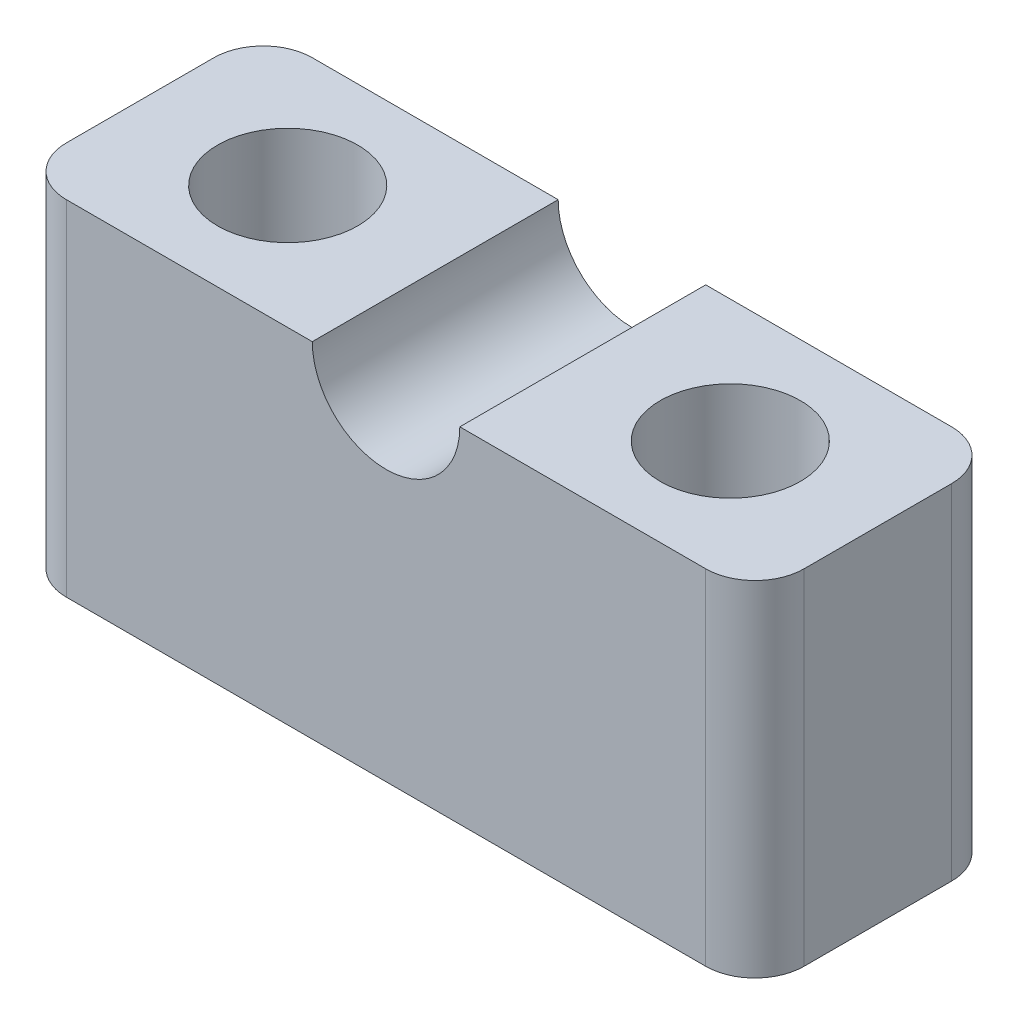
ISO-10303-21;
HEADER;
FILE_DESCRIPTION(('STEP AP214'),'2;1');
FILE_NAME('part.step','',(''),(''),'','','');
FILE_SCHEMA(('AUTOMOTIVE_DESIGN { 1 0 10303 214 1 1 1 1 }'));
ENDSEC;
DATA;
#1=APPLICATION_CONTEXT('core data for automotive mechanical design processes');
#2=APPLICATION_PROTOCOL_DEFINITION('international standard','automotive_design',2000,#1);
#3=PRODUCT_CONTEXT('',#1,'mechanical');
#4=PRODUCT('Part','Part','',(#3));
#5=PRODUCT_RELATED_PRODUCT_CATEGORY('part','',(#4));
#6=PRODUCT_DEFINITION_FORMATION('','',#4);
#7=PRODUCT_DEFINITION_CONTEXT('part definition',#1,'design');
#8=PRODUCT_DEFINITION('design','',#6,#7);
#9=PRODUCT_DEFINITION_SHAPE('','',#8);
#10=(LENGTH_UNIT() NAMED_UNIT(*) SI_UNIT(.MILLI.,.METRE.));
#11=(NAMED_UNIT(*) PLANE_ANGLE_UNIT() SI_UNIT($,.RADIAN.));
#12=(NAMED_UNIT(*) SI_UNIT($,.STERADIAN.) SOLID_ANGLE_UNIT());
#13=UNCERTAINTY_MEASURE_WITH_UNIT(LENGTH_MEASURE(1.E-05),#10,'distance_accuracy_value','');
#14=(GEOMETRIC_REPRESENTATION_CONTEXT(3) GLOBAL_UNCERTAINTY_ASSIGNED_CONTEXT((#13)) GLOBAL_UNIT_ASSIGNED_CONTEXT((#10,
#11,#12)) REPRESENTATION_CONTEXT('',''));
#15=CARTESIAN_POINT('',(0.,0.,0.));
#16=DIRECTION('',(0.,0.,1.));
#17=DIRECTION('',(1.,0.,0.));
#18=AXIS2_PLACEMENT_3D('',#15,#16,#17);
#19=CARTESIAN_POINT('',(0.,7.,0.));
#20=DIRECTION('',(0.,-1.,0.));
#21=DIRECTION('',(0.,0.,-1.));
#22=AXIS2_PLACEMENT_3D('',#19,#20,#21);
#23=PLANE('',#22);
#24=CARTESIAN_POINT('',(-1.05940594059406,7.,-0.346534653465347));
#25=DIRECTION('',(0.,1.,0.));
#26=DIRECTION('',(0.,0.,1.));
#27=AXIS2_PLACEMENT_3D('',#24,#25,#26);
#28=CIRCLE('',#27,1.425);
#29=CARTESIAN_POINT('',(-1.05940594059406,7.,1.07846534653465));
#30=VERTEX_POINT('',#29);
#31=EDGE_CURVE('E281',#30,#30,#28,.T.);
#32=ORIENTED_EDGE('',*,*,#31,.F.);
#33=EDGE_LOOP('',(#32));
#34=FACE_BOUND('',#33,.T.);
#35=DIRECTION('',(0.,0.,1.));
#36=VECTOR('',#35,1.);
#37=CARTESIAN_POINT('',(-4.05940594059406,7.,2.15346534653465));
#38=LINE('',#37,#36);
#39=CARTESIAN_POINT('',(-4.05940594059406,7.,-1.84653465346535));
#40=VERTEX_POINT('',#39);
#41=CARTESIAN_POINT('',(-4.05940594059406,7.,1.15346534653465));
#42=VERTEX_POINT('',#41);
#43=EDGE_CURVE('E169',#40,#42,#38,.T.);
#44=ORIENTED_EDGE('',*,*,#43,.T.);
#45=CARTESIAN_POINT('',(-3.05940594059406,7.,1.15346534653465));
#46=DIRECTION('',(0.,-1.,0.));
#47=DIRECTION('',(0.,0.,-1.));
#48=AXIS2_PLACEMENT_3D('',#45,#46,#47);
#49=CIRCLE('',#48,1.);
#50=CARTESIAN_POINT('',(-3.05940594059406,7.,2.15346534653465));
#51=VERTEX_POINT('',#50);
#52=EDGE_CURVE('E200',#42,#51,#49,.F.);
#53=ORIENTED_EDGE('',*,*,#52,.T.);
#54=DIRECTION('',(1.,0.,0.));
#55=VECTOR('',#54,1.);
#56=CARTESIAN_POINT('',(-4.05940594059406,7.,2.15346534653465));
#57=LINE('',#56,#55);
#58=CARTESIAN_POINT('',(1.94059405940594,7.,2.15346534653465));
#59=VERTEX_POINT('',#58);
#60=EDGE_CURVE('E139',#51,#59,#57,.T.);
#61=ORIENTED_EDGE('',*,*,#60,.T.);
#62=DIRECTION('',(0.,0.,-1.));
#63=VECTOR('',#62,1.);
#64=CARTESIAN_POINT('',(1.94059405940594,7.,2.15346534653465));
#65=LINE('',#64,#63);
#66=CARTESIAN_POINT('',(1.94059405940594,7.,-2.84653465346535));
#67=VERTEX_POINT('',#66);
#68=EDGE_CURVE('E123',#59,#67,#65,.T.);
#69=ORIENTED_EDGE('',*,*,#68,.T.);
#70=DIRECTION('',(-1.,0.,0.));
#71=VECTOR('',#70,1.);
#72=CARTESIAN_POINT('',(-4.05940594059406,7.,-2.84653465346535));
#73=LINE('',#72,#71);
#74=CARTESIAN_POINT('',(-3.05940594059406,7.,-2.84653465346535));
#75=VERTEX_POINT('',#74);
#76=EDGE_CURVE('E136',#67,#75,#73,.T.);
#77=ORIENTED_EDGE('',*,*,#76,.T.);
#78=CARTESIAN_POINT('',(-3.05940594059406,7.,-1.84653465346535));
#79=DIRECTION('',(0.,-1.,0.));
#80=DIRECTION('',(0.,0.,-1.));
#81=AXIS2_PLACEMENT_3D('',#78,#79,#80);
#82=CIRCLE('',#81,1.);
#83=EDGE_CURVE('E197',#75,#40,#82,.F.);
#84=ORIENTED_EDGE('',*,*,#83,.T.);
#85=EDGE_LOOP('',(#44,#53,#61,#69,#77,#84));
#86=FACE_BOUND('',#85,.T.);
#87=ADVANCED_FACE('F39',(#34,#86),#23,.F.);
#88=CARTESIAN_POINT('',(-4.05940594059406,7.,2.15346534653465));
#89=DIRECTION('',(1.,0.,0.));
#90=DIRECTION('',(0.,0.,-1.));
#91=AXIS2_PLACEMENT_3D('',#88,#89,#90);
#92=PLANE('',#91);
#93=DIRECTION('',(0.,0.,1.));
#94=VECTOR('',#93,1.);
#95=CARTESIAN_POINT('',(-4.05940594059406,0.,2.15346534653465));
#96=LINE('',#95,#94);
#97=CARTESIAN_POINT('',(-4.05940594059406,0.,-1.84653465346535));
#98=VERTEX_POINT('',#97);
#99=CARTESIAN_POINT('',(-4.05940594059406,0.,1.15346534653465));
#100=VERTEX_POINT('',#99);
#101=EDGE_CURVE('E155',#98,#100,#96,.T.);
#102=ORIENTED_EDGE('',*,*,#101,.T.);
#103=DIRECTION('',(0.,-1.,0.));
#104=VECTOR('',#103,1.);
#105=CARTESIAN_POINT('',(-4.05940594059406,7.,1.15346534653465));
#106=LINE('',#105,#104);
#107=EDGE_CURVE('E194',#100,#42,#106,.F.);
#108=ORIENTED_EDGE('',*,*,#107,.T.);
#109=ORIENTED_EDGE('',*,*,#43,.F.);
#110=DIRECTION('',(0.,-1.,0.));
#111=VECTOR('',#110,1.);
#112=CARTESIAN_POINT('',(-4.05940594059406,7.,-1.84653465346535));
#113=LINE('',#112,#111);
#114=EDGE_CURVE('E190',#40,#98,#113,.T.);
#115=ORIENTED_EDGE('',*,*,#114,.T.);
#116=EDGE_LOOP('',(#102,#108,#109,#115));
#117=FACE_BOUND('',#116,.T.);
#118=ADVANCED_FACE('F237',(#117),#92,.F.);
#119=CARTESIAN_POINT('',(-4.05940594059406,7.,2.15346534653465));
#120=DIRECTION('',(0.,0.,-1.));
#121=DIRECTION('',(-1.,0.,0.));
#122=AXIS2_PLACEMENT_3D('',#119,#120,#121);
#123=PLANE('',#122);
#124=ORIENTED_EDGE('',*,*,#60,.F.);
#125=DIRECTION('',(0.,-1.,0.));
#126=VECTOR('',#125,1.);
#127=CARTESIAN_POINT('',(-3.05940594059406,7.,2.15346534653465));
#128=LINE('',#127,#126);
#129=CARTESIAN_POINT('',(-3.05940594059406,0.,2.15346534653465));
#130=VERTEX_POINT('',#129);
#131=EDGE_CURVE('E174',#51,#130,#128,.T.);
#132=ORIENTED_EDGE('',*,*,#131,.T.);
#133=DIRECTION('',(1.,0.,0.));
#134=VECTOR('',#133,1.);
#135=CARTESIAN_POINT('',(-4.05940594059406,0.,2.15346534653465));
#136=LINE('',#135,#134);
#137=CARTESIAN_POINT('',(9.94059405940594,0.,2.15346534653465));
#138=VERTEX_POINT('',#137);
#139=EDGE_CURVE('E159',#130,#138,#136,.T.);
#140=ORIENTED_EDGE('',*,*,#139,.T.);
#141=DIRECTION('',(0.,-1.,0.));
#142=VECTOR('',#141,1.);
#143=CARTESIAN_POINT('',(9.94059405940594,7.,2.15346534653465));
#144=LINE('',#143,#142);
#145=CARTESIAN_POINT('',(9.94059405940594,7.,2.15346534653465));
#146=VERTEX_POINT('',#145);
#147=EDGE_CURVE('E141',#138,#146,#144,.F.);
#148=ORIENTED_EDGE('',*,*,#147,.T.);
#149=CARTESIAN_POINT('',(4.94059405940594,7.,2.15346534653465));
#150=VERTEX_POINT('',#149);
#151=EDGE_CURVE('E218',#150,#146,#57,.T.);
#152=ORIENTED_EDGE('',*,*,#151,.F.);
#153=CARTESIAN_POINT('',(3.44059405940594,7.,2.15346534653465));
#154=DIRECTION('',(0.,0.,-1.));
#155=DIRECTION('',(-1.,0.,0.));
#156=AXIS2_PLACEMENT_3D('',#153,#154,#155);
#157=CIRCLE('',#156,1.5);
#158=EDGE_CURVE('E130',#150,#59,#157,.T.);
#159=ORIENTED_EDGE('',*,*,#158,.T.);
#160=EDGE_LOOP('',(#124,#132,#140,#148,#152,#159));
#161=FACE_BOUND('',#160,.T.);
#162=ADVANCED_FACE('F229',(#161),#123,.F.);
#163=CARTESIAN_POINT('',(10.9405940594059,7.,2.15346534653465));
#164=DIRECTION('',(-1.,0.,0.));
#165=DIRECTION('',(0.,0.,1.));
#166=AXIS2_PLACEMENT_3D('',#163,#164,#165);
#167=PLANE('',#166);
#168=DIRECTION('',(0.,0.,-1.));
#169=VECTOR('',#168,1.);
#170=CARTESIAN_POINT('',(10.9405940594059,7.,2.15346534653465));
#171=LINE('',#170,#169);
#172=CARTESIAN_POINT('',(10.9405940594059,7.,1.15346534653465));
#173=VERTEX_POINT('',#172);
#174=CARTESIAN_POINT('',(10.9405940594059,7.,-1.84653465346535));
#175=VERTEX_POINT('',#174);
#176=EDGE_CURVE('E148',#173,#175,#171,.T.);
#177=ORIENTED_EDGE('',*,*,#176,.F.);
#178=DIRECTION('',(0.,-1.,0.));
#179=VECTOR('',#178,1.);
#180=CARTESIAN_POINT('',(10.9405940594059,7.,1.15346534653465));
#181=LINE('',#180,#179);
#182=CARTESIAN_POINT('',(10.9405940594059,0.,1.15346534653465));
#183=VERTEX_POINT('',#182);
#184=EDGE_CURVE('E205',#173,#183,#181,.T.);
#185=ORIENTED_EDGE('',*,*,#184,.T.);
#186=DIRECTION('',(0.,0.,-1.));
#187=VECTOR('',#186,1.);
#188=CARTESIAN_POINT('',(10.9405940594059,0.,2.15346534653465));
#189=LINE('',#188,#187);
#190=CARTESIAN_POINT('',(10.9405940594059,0.,-1.84653465346535));
#191=VERTEX_POINT('',#190);
#192=EDGE_CURVE('E163',#183,#191,#189,.T.);
#193=ORIENTED_EDGE('',*,*,#192,.T.);
#194=DIRECTION('',(0.,-1.,0.));
#195=VECTOR('',#194,1.);
#196=CARTESIAN_POINT('',(10.9405940594059,7.,-1.84653465346535));
#197=LINE('',#196,#195);
#198=EDGE_CURVE('E63',#191,#175,#197,.F.);
#199=ORIENTED_EDGE('',*,*,#198,.T.);
#200=EDGE_LOOP('',(#177,#185,#193,#199));
#201=FACE_BOUND('',#200,.T.);
#202=ADVANCED_FACE('F222',(#201),#167,.F.);
#203=CARTESIAN_POINT('',(-4.05940594059406,7.,-2.84653465346535));
#204=DIRECTION('',(0.,0.,1.));
#205=DIRECTION('',(1.,0.,0.));
#206=AXIS2_PLACEMENT_3D('',#203,#204,#205);
#207=PLANE('',#206);
#208=CARTESIAN_POINT('',(9.94059405940594,7.,-2.84653465346535));
#209=VERTEX_POINT('',#208);
#210=CARTESIAN_POINT('',(4.94059405940594,7.,-2.84653465346535));
#211=VERTEX_POINT('',#210);
#212=EDGE_CURVE('E147',#209,#211,#73,.T.);
#213=ORIENTED_EDGE('',*,*,#212,.F.);
#214=DIRECTION('',(0.,-1.,0.));
#215=VECTOR('',#214,1.);
#216=CARTESIAN_POINT('',(9.94059405940594,7.,-2.84653465346535));
#217=LINE('',#216,#215);
#218=CARTESIAN_POINT('',(9.94059405940594,0.,-2.84653465346535));
#219=VERTEX_POINT('',#218);
#220=EDGE_CURVE('E11',#209,#219,#217,.T.);
#221=ORIENTED_EDGE('',*,*,#220,.T.);
#222=DIRECTION('',(-1.,0.,0.));
#223=VECTOR('',#222,1.);
#224=CARTESIAN_POINT('',(-4.05940594059406,0.,-2.84653465346535));
#225=LINE('',#224,#223);
#226=CARTESIAN_POINT('',(-3.05940594059406,0.,-2.84653465346535));
#227=VERTEX_POINT('',#226);
#228=EDGE_CURVE('E166',#219,#227,#225,.T.);
#229=ORIENTED_EDGE('',*,*,#228,.T.);
#230=DIRECTION('',(0.,-1.,0.));
#231=VECTOR('',#230,1.);
#232=CARTESIAN_POINT('',(-3.05940594059406,7.,-2.84653465346535));
#233=LINE('',#232,#231);
#234=EDGE_CURVE('E48',#227,#75,#233,.F.);
#235=ORIENTED_EDGE('',*,*,#234,.T.);
#236=ORIENTED_EDGE('',*,*,#76,.F.);
#237=CARTESIAN_POINT('',(3.44059405940594,7.,-2.84653465346535));
#238=DIRECTION('',(0.,0.,-1.));
#239=DIRECTION('',(-1.,0.,0.));
#240=AXIS2_PLACEMENT_3D('',#237,#238,#239);
#241=CIRCLE('',#240,1.5);
#242=EDGE_CURVE('E120',#211,#67,#241,.T.);
#243=ORIENTED_EDGE('',*,*,#242,.F.);
#244=EDGE_LOOP('',(#213,#221,#229,#235,#236,#243));
#245=FACE_BOUND('',#244,.T.);
#246=ADVANCED_FACE('F143',(#245),#207,.F.);
#247=CARTESIAN_POINT('',(7.94059405940594,7.,-0.346534653465347));
#248=DIRECTION('',(0.,1.,0.));
#249=DIRECTION('',(0.,0.,1.));
#250=AXIS2_PLACEMENT_3D('',#247,#248,#249);
#251=CIRCLE('',#250,1.425);
#252=CARTESIAN_POINT('',(7.94059405940594,7.,1.07846534653465));
#253=VERTEX_POINT('',#252);
#254=EDGE_CURVE('E271',#253,#253,#251,.T.);
#255=ORIENTED_EDGE('',*,*,#254,.F.);
#256=EDGE_LOOP('',(#255));
#257=FACE_BOUND('',#256,.T.);
#258=ORIENTED_EDGE('',*,*,#151,.T.);
#259=CARTESIAN_POINT('',(9.94059405940594,7.,1.15346534653465));
#260=DIRECTION('',(0.,-1.,0.));
#261=DIRECTION('',(0.,0.,-1.));
#262=AXIS2_PLACEMENT_3D('',#259,#260,#261);
#263=CIRCLE('',#262,1.);
#264=EDGE_CURVE('E211',#146,#173,#263,.F.);
#265=ORIENTED_EDGE('',*,*,#264,.T.);
#266=ORIENTED_EDGE('',*,*,#176,.T.);
#267=CARTESIAN_POINT('',(9.94059405940594,7.,-1.84653465346535));
#268=DIRECTION('',(0.,-1.,0.));
#269=DIRECTION('',(0.,0.,-1.));
#270=AXIS2_PLACEMENT_3D('',#267,#268,#269);
#271=CIRCLE('',#270,1.);
#272=EDGE_CURVE('E55',#175,#209,#271,.F.);
#273=ORIENTED_EDGE('',*,*,#272,.T.);
#274=ORIENTED_EDGE('',*,*,#212,.T.);
#275=DIRECTION('',(0.,0.,-1.));
#276=VECTOR('',#275,1.);
#277=CARTESIAN_POINT('',(4.94059405940594,7.,2.15346534653465));
#278=LINE('',#277,#276);
#279=EDGE_CURVE('E126',#211,#150,#278,.F.);
#280=ORIENTED_EDGE('',*,*,#279,.T.);
#281=EDGE_LOOP('',(#258,#265,#266,#273,#274,#280));
#282=FACE_BOUND('',#281,.T.);
#283=ADVANCED_FACE('F216',(#257,#282),#23,.F.);
#284=CARTESIAN_POINT('',(0.,0.,0.));
#285=DIRECTION('',(0.,-1.,0.));
#286=DIRECTION('',(0.,0.,-1.));
#287=AXIS2_PLACEMENT_3D('',#284,#285,#286);
#288=PLANE('',#287);
#289=CARTESIAN_POINT('',(7.94059405940594,0.,-0.346534653465347));
#290=DIRECTION('',(0.,1.,0.));
#291=DIRECTION('',(0.,0.,1.));
#292=AXIS2_PLACEMENT_3D('',#289,#290,#291);
#293=CIRCLE('',#292,1.425);
#294=CARTESIAN_POINT('',(7.94059405940594,0.,1.07846534653465));
#295=VERTEX_POINT('',#294);
#296=EDGE_CURVE('E131',#295,#295,#293,.T.);
#297=ORIENTED_EDGE('',*,*,#296,.T.);
#298=EDGE_LOOP('',(#297));
#299=FACE_BOUND('',#298,.T.);
#300=CARTESIAN_POINT('',(-1.05940594059406,0.,-0.346534653465347));
#301=DIRECTION('',(0.,1.,0.));
#302=DIRECTION('',(0.,0.,1.));
#303=AXIS2_PLACEMENT_3D('',#300,#301,#302);
#304=CIRCLE('',#303,1.425);
#305=CARTESIAN_POINT('',(-1.05940594059406,0.,1.07846534653465));
#306=VERTEX_POINT('',#305);
#307=EDGE_CURVE('E274',#306,#306,#304,.T.);
#308=ORIENTED_EDGE('',*,*,#307,.T.);
#309=EDGE_LOOP('',(#308));
#310=FACE_BOUND('',#309,.T.);
#311=ORIENTED_EDGE('',*,*,#139,.F.);
#312=CARTESIAN_POINT('',(-3.05940594059406,0.,1.15346534653465));
#313=DIRECTION('',(0.,-1.,0.));
#314=DIRECTION('',(0.,0.,-1.));
#315=AXIS2_PLACEMENT_3D('',#312,#313,#314);
#316=CIRCLE('',#315,1.);
#317=EDGE_CURVE('E187',#130,#100,#316,.T.);
#318=ORIENTED_EDGE('',*,*,#317,.T.);
#319=ORIENTED_EDGE('',*,*,#101,.F.);
#320=CARTESIAN_POINT('',(-3.05940594059406,0.,-1.84653465346535));
#321=DIRECTION('',(0.,-1.,0.));
#322=DIRECTION('',(0.,0.,-1.));
#323=AXIS2_PLACEMENT_3D('',#320,#321,#322);
#324=CIRCLE('',#323,1.);
#325=EDGE_CURVE('E178',#98,#227,#324,.T.);
#326=ORIENTED_EDGE('',*,*,#325,.T.);
#327=ORIENTED_EDGE('',*,*,#228,.F.);
#328=CARTESIAN_POINT('',(9.94059405940594,0.,-1.84653465346535));
#329=DIRECTION('',(0.,-1.,0.));
#330=DIRECTION('',(0.,0.,-1.));
#331=AXIS2_PLACEMENT_3D('',#328,#329,#330);
#332=CIRCLE('',#331,1.);
#333=EDGE_CURVE('E181',#219,#191,#332,.T.);
#334=ORIENTED_EDGE('',*,*,#333,.T.);
#335=ORIENTED_EDGE('',*,*,#192,.F.);
#336=CARTESIAN_POINT('',(9.94059405940594,0.,1.15346534653465));
#337=DIRECTION('',(0.,-1.,0.));
#338=DIRECTION('',(0.,0.,-1.));
#339=AXIS2_PLACEMENT_3D('',#336,#337,#338);
#340=CIRCLE('',#339,1.);
#341=EDGE_CURVE('E184',#183,#138,#340,.T.);
#342=ORIENTED_EDGE('',*,*,#341,.T.);
#343=EDGE_LOOP('',(#311,#318,#319,#326,#327,#334,#335,#342));
#344=FACE_BOUND('',#343,.T.);
#345=ADVANCED_FACE('F227',(#299,#310,#344),#288,.T.);
#346=CARTESIAN_POINT('',(3.44059405940594,7.,2.15346534653465));
#347=DIRECTION('',(0.,0.,-1.));
#348=DIRECTION('',(-1.,0.,0.));
#349=AXIS2_PLACEMENT_3D('',#346,#347,#348);
#350=CYLINDRICAL_SURFACE('',#349,1.5);
#351=ORIENTED_EDGE('',*,*,#158,.F.);
#352=ORIENTED_EDGE('',*,*,#279,.F.);
#353=ORIENTED_EDGE('',*,*,#242,.T.);
#354=ORIENTED_EDGE('',*,*,#68,.F.);
#355=EDGE_LOOP('',(#351,#352,#353,#354));
#356=FACE_BOUND('',#355,.T.);
#357=ADVANCED_FACE('F122',(#356),#350,.F.);
#358=CARTESIAN_POINT('',(-1.05940594059406,0.,-0.346534653465347));
#359=DIRECTION('',(0.,1.,0.));
#360=DIRECTION('',(0.,0.,1.));
#361=AXIS2_PLACEMENT_3D('',#358,#359,#360);
#362=CYLINDRICAL_SURFACE('',#361,1.425);
#363=ORIENTED_EDGE('',*,*,#307,.F.);
#364=EDGE_LOOP('',(#363));
#365=FACE_BOUND('',#364,.T.);
#366=ORIENTED_EDGE('',*,*,#31,.T.);
#367=EDGE_LOOP('',(#366));
#368=FACE_BOUND('',#367,.T.);
#369=ADVANCED_FACE('F293',(#365,#368),#362,.F.);
#370=CARTESIAN_POINT('',(7.94059405940594,0.,-0.346534653465347));
#371=DIRECTION('',(0.,1.,0.));
#372=DIRECTION('',(0.,0.,1.));
#373=AXIS2_PLACEMENT_3D('',#370,#371,#372);
#374=CYLINDRICAL_SURFACE('',#373,1.425);
#375=ORIENTED_EDGE('',*,*,#296,.F.);
#376=EDGE_LOOP('',(#375));
#377=FACE_BOUND('',#376,.T.);
#378=ORIENTED_EDGE('',*,*,#254,.T.);
#379=EDGE_LOOP('',(#378));
#380=FACE_BOUND('',#379,.T.);
#381=ADVANCED_FACE('F295',(#377,#380),#374,.F.);
#382=CARTESIAN_POINT('',(-3.05940594059406,7.,1.15346534653465));
#383=DIRECTION('',(0.,-1.,0.));
#384=DIRECTION('',(0.,0.,-1.));
#385=AXIS2_PLACEMENT_3D('',#382,#383,#384);
#386=CYLINDRICAL_SURFACE('',#385,1.);
#387=ORIENTED_EDGE('',*,*,#52,.F.);
#388=ORIENTED_EDGE('',*,*,#107,.F.);
#389=ORIENTED_EDGE('',*,*,#317,.F.);
#390=ORIENTED_EDGE('',*,*,#131,.F.);
#391=EDGE_LOOP('',(#387,#388,#389,#390));
#392=FACE_BOUND('',#391,.T.);
#393=ADVANCED_FACE('F233',(#392),#386,.T.);
#394=CARTESIAN_POINT('',(9.94059405940594,7.,1.15346534653465));
#395=DIRECTION('',(0.,-1.,0.));
#396=DIRECTION('',(0.,0.,-1.));
#397=AXIS2_PLACEMENT_3D('',#394,#395,#396);
#398=CYLINDRICAL_SURFACE('',#397,1.);
#399=ORIENTED_EDGE('',*,*,#264,.F.);
#400=ORIENTED_EDGE('',*,*,#147,.F.);
#401=ORIENTED_EDGE('',*,*,#341,.F.);
#402=ORIENTED_EDGE('',*,*,#184,.F.);
#403=EDGE_LOOP('',(#399,#400,#401,#402));
#404=FACE_BOUND('',#403,.T.);
#405=ADVANCED_FACE('F224',(#404),#398,.T.);
#406=CARTESIAN_POINT('',(9.94059405940594,7.,-1.84653465346535));
#407=DIRECTION('',(0.,-1.,0.));
#408=DIRECTION('',(0.,0.,-1.));
#409=AXIS2_PLACEMENT_3D('',#406,#407,#408);
#410=CYLINDRICAL_SURFACE('',#409,1.);
#411=ORIENTED_EDGE('',*,*,#272,.F.);
#412=ORIENTED_EDGE('',*,*,#198,.F.);
#413=ORIENTED_EDGE('',*,*,#333,.F.);
#414=ORIENTED_EDGE('',*,*,#220,.F.);
#415=EDGE_LOOP('',(#411,#412,#413,#414));
#416=FACE_BOUND('',#415,.T.);
#417=ADVANCED_FACE('F244',(#416),#410,.T.);
#418=CARTESIAN_POINT('',(-3.05940594059406,7.,-1.84653465346535));
#419=DIRECTION('',(0.,-1.,0.));
#420=DIRECTION('',(0.,0.,-1.));
#421=AXIS2_PLACEMENT_3D('',#418,#419,#420);
#422=CYLINDRICAL_SURFACE('',#421,1.);
#423=ORIENTED_EDGE('',*,*,#83,.F.);
#424=ORIENTED_EDGE('',*,*,#234,.F.);
#425=ORIENTED_EDGE('',*,*,#325,.F.);
#426=ORIENTED_EDGE('',*,*,#114,.F.);
#427=EDGE_LOOP('',(#423,#424,#425,#426));
#428=FACE_BOUND('',#427,.T.);
#429=ADVANCED_FACE('F41',(#428),#422,.T.);
#430=CLOSED_SHELL('',(#87,#118,#162,#202,#246,#283,#345,#357,#369,#381,#393,#405,#417,#429));
#431=MANIFOLD_SOLID_BREP('B2',#430);
#432=ADVANCED_BREP_SHAPE_REPRESENTATION('',(#18,#431),#14);
#433=SHAPE_DEFINITION_REPRESENTATION(#9,#432);
ENDSEC;
END-ISO-10303-21;
